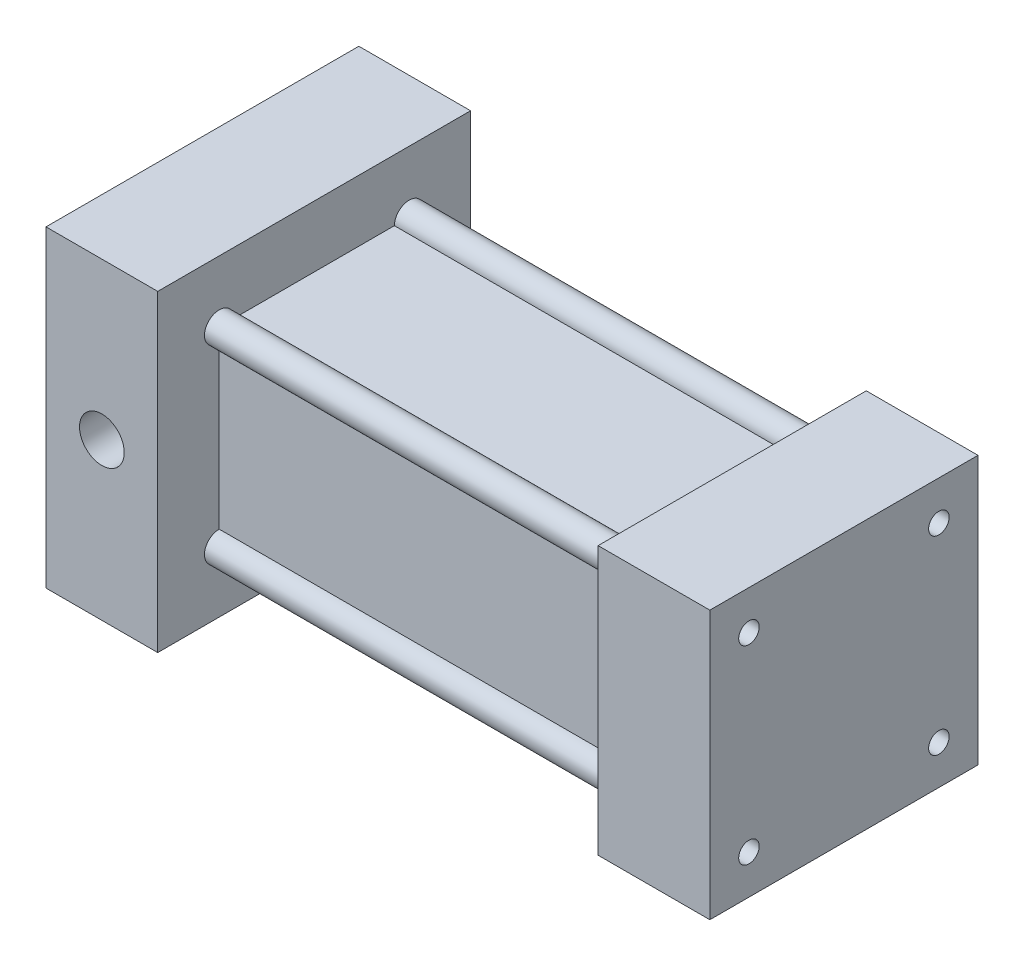
ISO-10303-21;
HEADER;
FILE_DESCRIPTION(('STEP AP214'),'2;1');
FILE_NAME('part.step','',(''),(''),'','','');
FILE_SCHEMA(('AUTOMOTIVE_DESIGN { 1 0 10303 214 1 1 1 1 }'));
ENDSEC;
DATA;
#1=APPLICATION_CONTEXT('core data for automotive mechanical design processes');
#2=APPLICATION_PROTOCOL_DEFINITION('international standard','automotive_design',2000,#1);
#3=PRODUCT_CONTEXT('',#1,'mechanical');
#4=PRODUCT('Part','Part','',(#3));
#5=PRODUCT_RELATED_PRODUCT_CATEGORY('part','',(#4));
#6=PRODUCT_DEFINITION_FORMATION('','',#4);
#7=PRODUCT_DEFINITION_CONTEXT('part definition',#1,'design');
#8=PRODUCT_DEFINITION('design','',#6,#7);
#9=PRODUCT_DEFINITION_SHAPE('','',#8);
#10=(LENGTH_UNIT() NAMED_UNIT(*) SI_UNIT(.MILLI.,.METRE.));
#11=(NAMED_UNIT(*) PLANE_ANGLE_UNIT() SI_UNIT($,.RADIAN.));
#12=(NAMED_UNIT(*) SI_UNIT($,.STERADIAN.) SOLID_ANGLE_UNIT());
#13=UNCERTAINTY_MEASURE_WITH_UNIT(LENGTH_MEASURE(1.E-05),#10,'distance_accuracy_value','');
#14=(GEOMETRIC_REPRESENTATION_CONTEXT(3) GLOBAL_UNCERTAINTY_ASSIGNED_CONTEXT((#13)) GLOBAL_UNIT_ASSIGNED_CONTEXT((#10,
#11,#12)) REPRESENTATION_CONTEXT('',''));
#15=CARTESIAN_POINT('',(0.,0.,0.));
#16=DIRECTION('',(0.,0.,1.));
#17=DIRECTION('',(1.,0.,0.));
#18=AXIS2_PLACEMENT_3D('',#15,#16,#17);
#19=CARTESIAN_POINT('',(67.33286,-13.49248,-13.49248));
#20=DIRECTION('',(0.,0.,1.));
#21=DIRECTION('',(0.,-1.,0.));
#22=AXIS2_PLACEMENT_3D('',#19,#20,#21);
#23=PLANE('',#22);
#24=DIRECTION('',(-1.,0.,0.));
#25=VECTOR('',#24,1.);
#26=CARTESIAN_POINT('',(73.2526448350306,-11.39952,-13.49248));
#27=LINE('',#26,#25);
#28=CARTESIAN_POINT('',(7.9375,-11.39952,-13.49248));
#29=VERTEX_POINT('',#28);
#30=CARTESIAN_POINT('',(67.3328600000218,-11.39952,-13.49248));
#31=VERTEX_POINT('',#30);
#32=EDGE_CURVE('E56',#29,#31,#27,.F.);
#33=ORIENTED_EDGE('',*,*,#32,.F.);
#34=DIRECTION('',(0.,1.,0.));
#35=VECTOR('',#34,1.);
#36=CARTESIAN_POINT('',(7.9375,-13.49248,-13.49248));
#37=LINE('',#36,#35);
#38=CARTESIAN_POINT('',(7.9375,11.39952,-13.49248));
#39=VERTEX_POINT('',#38);
#40=EDGE_CURVE('E187',#29,#39,#37,.T.);
#41=ORIENTED_EDGE('',*,*,#40,.T.);
#42=DIRECTION('',(-1.,0.,0.));
#43=VECTOR('',#42,1.);
#44=CARTESIAN_POINT('',(73.2526448350306,11.39952,-13.49248));
#45=LINE('',#44,#43);
#46=CARTESIAN_POINT('',(67.3328600000218,11.39952,-13.49248));
#47=VERTEX_POINT('',#46);
#48=EDGE_CURVE('E358',#47,#39,#45,.T.);
#49=ORIENTED_EDGE('',*,*,#48,.F.);
#50=DIRECTION('',(0.,1.,0.));
#51=VECTOR('',#50,1.);
#52=CARTESIAN_POINT('',(67.33286,-13.49248,-13.49248));
#53=LINE('',#52,#51);
#54=EDGE_CURVE('E170',#31,#47,#53,.T.);
#55=ORIENTED_EDGE('',*,*,#54,.F.);
#56=EDGE_LOOP('',(#33,#41,#49,#55));
#57=FACE_BOUND('',#56,.T.);
#58=ADVANCED_FACE('F41',(#57),#23,.F.);
#59=CARTESIAN_POINT('',(67.33286,-13.49248,-13.49248));
#60=DIRECTION('',(0.,-1.,0.));
#61=DIRECTION('',(1.,0.,0.));
#62=AXIS2_PLACEMENT_3D('',#59,#60,#61);
#63=PLANE('',#62);
#64=DIRECTION('',(0.,0.,1.));
#65=VECTOR('',#64,1.);
#66=CARTESIAN_POINT('',(7.9375,-13.49248,-13.49248));
#67=LINE('',#66,#65);
#68=CARTESIAN_POINT('',(7.9375,-13.49248,-11.39952));
#69=VERTEX_POINT('',#68);
#70=CARTESIAN_POINT('',(7.9375,-13.49248,11.39952));
#71=VERTEX_POINT('',#70);
#72=EDGE_CURVE('E164',#69,#71,#67,.T.);
#73=ORIENTED_EDGE('',*,*,#72,.F.);
#74=DIRECTION('',(-1.,0.,0.));
#75=VECTOR('',#74,1.);
#76=CARTESIAN_POINT('',(73.2526448350306,-13.49248,-11.39952));
#77=LINE('',#76,#75);
#78=CARTESIAN_POINT('',(67.3328600000218,-13.49248,-11.39952));
#79=VERTEX_POINT('',#78);
#80=EDGE_CURVE('E153',#69,#79,#77,.F.);
#81=ORIENTED_EDGE('',*,*,#80,.T.);
#82=DIRECTION('',(0.,0.,1.));
#83=VECTOR('',#82,1.);
#84=CARTESIAN_POINT('',(67.33286,-13.49248,-13.49248));
#85=LINE('',#84,#83);
#86=CARTESIAN_POINT('',(67.3328600000218,-13.49248,11.39952));
#87=VERTEX_POINT('',#86);
#88=EDGE_CURVE('E162',#79,#87,#85,.T.);
#89=ORIENTED_EDGE('',*,*,#88,.T.);
#90=DIRECTION('',(-1.,0.,0.));
#91=VECTOR('',#90,1.);
#92=CARTESIAN_POINT('',(73.2526448350306,-13.49248,11.39952));
#93=LINE('',#92,#91);
#94=EDGE_CURVE('E237',#87,#71,#93,.T.);
#95=ORIENTED_EDGE('',*,*,#94,.T.);
#96=EDGE_LOOP('',(#73,#81,#89,#95));
#97=FACE_BOUND('',#96,.T.);
#98=ADVANCED_FACE('F160',(#97),#63,.T.);
#99=CARTESIAN_POINT('',(67.33286,13.49248,13.49248));
#100=DIRECTION('',(0.,1.,0.));
#101=DIRECTION('',(-1.,0.,0.));
#102=AXIS2_PLACEMENT_3D('',#99,#100,#101);
#103=PLANE('',#102);
#104=DIRECTION('',(0.,0.,-1.));
#105=VECTOR('',#104,1.);
#106=CARTESIAN_POINT('',(67.33286,13.49248,13.49248));
#107=LINE('',#106,#105);
#108=CARTESIAN_POINT('',(67.3328600000218,13.49248,11.39952));
#109=VERTEX_POINT('',#108);
#110=CARTESIAN_POINT('',(67.3328600000218,13.49248,-11.39952));
#111=VERTEX_POINT('',#110);
#112=EDGE_CURVE('E173',#109,#111,#107,.T.);
#113=ORIENTED_EDGE('',*,*,#112,.T.);
#114=DIRECTION('',(-1.,0.,0.));
#115=VECTOR('',#114,1.);
#116=CARTESIAN_POINT('',(73.2526448350306,13.49248,-11.39952));
#117=LINE('',#116,#115);
#118=CARTESIAN_POINT('',(7.9375,13.49248,-11.39952));
#119=VERTEX_POINT('',#118);
#120=EDGE_CURVE('E63',#111,#119,#117,.T.);
#121=ORIENTED_EDGE('',*,*,#120,.T.);
#122=DIRECTION('',(0.,0.,-1.));
#123=VECTOR('',#122,1.);
#124=CARTESIAN_POINT('',(7.9375,13.49248,13.49248));
#125=LINE('',#124,#123);
#126=CARTESIAN_POINT('',(7.9375,13.49248,11.39952));
#127=VERTEX_POINT('',#126);
#128=EDGE_CURVE('E175',#127,#119,#125,.T.);
#129=ORIENTED_EDGE('',*,*,#128,.F.);
#130=DIRECTION('',(-1.,0.,0.));
#131=VECTOR('',#130,1.);
#132=CARTESIAN_POINT('',(73.2526448350306,13.49248,11.39952));
#133=LINE('',#132,#131);
#134=EDGE_CURVE('E239',#127,#109,#133,.F.);
#135=ORIENTED_EDGE('',*,*,#134,.T.);
#136=EDGE_LOOP('',(#113,#121,#129,#135));
#137=FACE_BOUND('',#136,.T.);
#138=ADVANCED_FACE('F312',(#137),#103,.T.);
#139=CARTESIAN_POINT('',(67.33286,13.49248,13.49248));
#140=DIRECTION('',(0.,0.,-1.));
#141=DIRECTION('',(0.,1.,0.));
#142=AXIS2_PLACEMENT_3D('',#139,#140,#141);
#143=PLANE('',#142);
#144=DIRECTION('',(-1.,0.,0.));
#145=VECTOR('',#144,1.);
#146=CARTESIAN_POINT('',(73.2526448350306,-11.39952,13.49248));
#147=LINE('',#146,#145);
#148=CARTESIAN_POINT('',(67.3328600000218,-11.39952,13.49248));
#149=VERTEX_POINT('',#148);
#150=CARTESIAN_POINT('',(7.9375,-11.39952,13.49248));
#151=VERTEX_POINT('',#150);
#152=EDGE_CURVE('E232',#149,#151,#147,.T.);
#153=ORIENTED_EDGE('',*,*,#152,.F.);
#154=DIRECTION('',(0.,-1.,0.));
#155=VECTOR('',#154,1.);
#156=CARTESIAN_POINT('',(67.33286,13.49248,13.49248));
#157=LINE('',#156,#155);
#158=CARTESIAN_POINT('',(67.3328600000218,11.39952,13.49248));
#159=VERTEX_POINT('',#158);
#160=EDGE_CURVE('E171',#159,#149,#157,.T.);
#161=ORIENTED_EDGE('',*,*,#160,.F.);
#162=DIRECTION('',(-1.,0.,0.));
#163=VECTOR('',#162,1.);
#164=CARTESIAN_POINT('',(73.2526448350306,11.39952,13.49248));
#165=LINE('',#164,#163);
#166=CARTESIAN_POINT('',(7.9375,11.39952,13.49248));
#167=VERTEX_POINT('',#166);
#168=EDGE_CURVE('E230',#167,#159,#165,.F.);
#169=ORIENTED_EDGE('',*,*,#168,.F.);
#170=DIRECTION('',(0.,-1.,0.));
#171=VECTOR('',#170,1.);
#172=CARTESIAN_POINT('',(7.9375,13.49248,13.49248));
#173=LINE('',#172,#171);
#174=EDGE_CURVE('E182',#167,#151,#173,.T.);
#175=ORIENTED_EDGE('',*,*,#174,.T.);
#176=EDGE_LOOP('',(#153,#161,#169,#175));
#177=FACE_BOUND('',#176,.T.);
#178=ADVANCED_FACE('F229',(#177),#143,.F.);
#179=CARTESIAN_POINT('',(7.93750000000001,22.225,22.225));
#180=DIRECTION('',(1.,0.,0.));
#181=DIRECTION('',(0.,1.,0.));
#182=AXIS2_PLACEMENT_3D('',#179,#180,#181);
#183=PLANE('',#182);
#184=DIRECTION('',(0.,-1.,0.));
#185=VECTOR('',#184,1.);
#186=CARTESIAN_POINT('',(7.93750000000001,22.225,-22.225));
#187=LINE('',#186,#185);
#188=CARTESIAN_POINT('',(7.93750000000001,22.225,-22.225));
#189=VERTEX_POINT('',#188);
#190=CARTESIAN_POINT('',(7.9375,-22.225,-22.225));
#191=VERTEX_POINT('',#190);
#192=EDGE_CURVE('E208',#189,#191,#187,.T.);
#193=ORIENTED_EDGE('',*,*,#192,.F.);
#194=DIRECTION('',(0.,0.,-1.));
#195=VECTOR('',#194,1.);
#196=CARTESIAN_POINT('',(7.93750000000001,22.225,22.225));
#197=LINE('',#196,#195);
#198=CARTESIAN_POINT('',(7.93750000000001,22.225,22.225));
#199=VERTEX_POINT('',#198);
#200=EDGE_CURVE('E218',#199,#189,#197,.T.);
#201=ORIENTED_EDGE('',*,*,#200,.F.);
#202=DIRECTION('',(0.,-1.,0.));
#203=VECTOR('',#202,1.);
#204=CARTESIAN_POINT('',(7.93750000000001,22.225,22.225));
#205=LINE('',#204,#203);
#206=CARTESIAN_POINT('',(7.9375,-22.225,22.225));
#207=VERTEX_POINT('',#206);
#208=EDGE_CURVE('E197',#199,#207,#205,.T.);
#209=ORIENTED_EDGE('',*,*,#208,.T.);
#210=DIRECTION('',(0.,0.,-1.));
#211=VECTOR('',#210,1.);
#212=CARTESIAN_POINT('',(7.9375,-22.225,22.225));
#213=LINE('',#212,#211);
#214=EDGE_CURVE('E216',#207,#191,#213,.T.);
#215=ORIENTED_EDGE('',*,*,#214,.T.);
#216=EDGE_LOOP('',(#193,#201,#209,#215));
#217=FACE_BOUND('',#216,.T.);
#218=ORIENTED_EDGE('',*,*,#40,.F.);
#219=CARTESIAN_POINT('',(7.9375,-13.49248,-13.49248));
#220=DIRECTION('',(1.,0.,0.));
#221=DIRECTION('',(0.,1.,0.));
#222=AXIS2_PLACEMENT_3D('',#219,#220,#221);
#223=CIRCLE('',#222,2.09296);
#224=EDGE_CURVE('E165',#69,#29,#223,.T.);
#225=ORIENTED_EDGE('',*,*,#224,.F.);
#226=ORIENTED_EDGE('',*,*,#72,.T.);
#227=CARTESIAN_POINT('',(7.9375,-13.49248,13.49248));
#228=DIRECTION('',(1.,0.,0.));
#229=DIRECTION('',(0.,1.,0.));
#230=AXIS2_PLACEMENT_3D('',#227,#228,#229);
#231=CIRCLE('',#230,2.09296);
#232=EDGE_CURVE('E241',#151,#71,#231,.T.);
#233=ORIENTED_EDGE('',*,*,#232,.F.);
#234=ORIENTED_EDGE('',*,*,#174,.F.);
#235=CARTESIAN_POINT('',(7.9375,13.49248,13.49248));
#236=DIRECTION('',(1.,0.,0.));
#237=DIRECTION('',(0.,1.,0.));
#238=AXIS2_PLACEMENT_3D('',#235,#236,#237);
#239=CIRCLE('',#238,2.09296);
#240=EDGE_CURVE('E236',#127,#167,#239,.T.);
#241=ORIENTED_EDGE('',*,*,#240,.F.);
#242=ORIENTED_EDGE('',*,*,#128,.T.);
#243=CARTESIAN_POINT('',(7.9375,13.49248,-13.49248));
#244=DIRECTION('',(1.,0.,0.));
#245=DIRECTION('',(0.,1.,0.));
#246=AXIS2_PLACEMENT_3D('',#243,#244,#245);
#247=CIRCLE('',#246,2.09296);
#248=EDGE_CURVE('E355',#39,#119,#247,.T.);
#249=ORIENTED_EDGE('',*,*,#248,.F.);
#250=EDGE_LOOP('',(#218,#225,#226,#233,#234,#241,#242,#249));
#251=FACE_BOUND('',#250,.T.);
#252=ADVANCED_FACE('F319',(#217,#251),#183,.T.);
#253=CARTESIAN_POINT('',(-7.9375,-22.225,22.225));
#254=DIRECTION('',(-1.,0.,0.));
#255=DIRECTION('',(0.,0.,1.));
#256=AXIS2_PLACEMENT_3D('',#253,#254,#255);
#257=PLANE('',#256);
#258=CARTESIAN_POINT('',(-7.9375,0.,0.));
#259=DIRECTION('',(-1.,0.,0.));
#260=DIRECTION('',(0.,0.,1.));
#261=AXIS2_PLACEMENT_3D('',#258,#259,#260);
#262=CIRCLE('',#261,4.7625);
#263=CARTESIAN_POINT('',(-7.9375,0.,4.7625));
#264=VERTEX_POINT('',#263);
#265=EDGE_CURVE('E720',#264,#264,#262,.T.);
#266=ORIENTED_EDGE('',*,*,#265,.F.);
#267=EDGE_LOOP('',(#266));
#268=FACE_BOUND('',#267,.T.);
#269=DIRECTION('',(0.,1.,0.));
#270=VECTOR('',#269,1.);
#271=CARTESIAN_POINT('',(-7.9375,-22.225,-22.225));
#272=LINE('',#271,#270);
#273=CARTESIAN_POINT('',(-7.9375,-22.225,-22.225));
#274=VERTEX_POINT('',#273);
#275=CARTESIAN_POINT('',(-7.9375,22.225,-22.225));
#276=VERTEX_POINT('',#275);
#277=EDGE_CURVE('E181',#274,#276,#272,.T.);
#278=ORIENTED_EDGE('',*,*,#277,.F.);
#279=DIRECTION('',(0.,0.,-1.));
#280=VECTOR('',#279,1.);
#281=CARTESIAN_POINT('',(-7.9375,-22.225,22.225));
#282=LINE('',#281,#280);
#283=CARTESIAN_POINT('',(-7.9375,-22.225,22.225));
#284=VERTEX_POINT('',#283);
#285=EDGE_CURVE('E213',#284,#274,#282,.T.);
#286=ORIENTED_EDGE('',*,*,#285,.F.);
#287=DIRECTION('',(0.,1.,0.));
#288=VECTOR('',#287,1.);
#289=CARTESIAN_POINT('',(-7.9375,-22.225,22.225));
#290=LINE('',#289,#288);
#291=CARTESIAN_POINT('',(-7.9375,22.225,22.225));
#292=VERTEX_POINT('',#291);
#293=EDGE_CURVE('E191',#284,#292,#290,.T.);
#294=ORIENTED_EDGE('',*,*,#293,.T.);
#295=DIRECTION('',(0.,0.,-1.));
#296=VECTOR('',#295,1.);
#297=CARTESIAN_POINT('',(-7.9375,22.225,22.225));
#298=LINE('',#297,#296);
#299=EDGE_CURVE('E202',#292,#276,#298,.T.);
#300=ORIENTED_EDGE('',*,*,#299,.T.);
#301=EDGE_LOOP('',(#278,#286,#294,#300));
#302=FACE_BOUND('',#301,.T.);
#303=ADVANCED_FACE('F43',(#268,#302),#257,.T.);
#304=CARTESIAN_POINT('',(-7.9375,-22.225,22.225));
#305=DIRECTION('',(0.,1.,0.));
#306=DIRECTION('',(0.,0.,1.));
#307=AXIS2_PLACEMENT_3D('',#304,#305,#306);
#308=PLANE('',#307);
#309=DIRECTION('',(1.,0.,0.));
#310=VECTOR('',#309,1.);
#311=CARTESIAN_POINT('',(-7.9375,-22.225,-22.225));
#312=LINE('',#311,#310);
#313=EDGE_CURVE('E195',#274,#191,#312,.T.);
#314=ORIENTED_EDGE('',*,*,#313,.T.);
#315=ORIENTED_EDGE('',*,*,#214,.F.);
#316=DIRECTION('',(1.,0.,0.));
#317=VECTOR('',#316,1.);
#318=CARTESIAN_POINT('',(-7.9375,-22.225,22.225));
#319=LINE('',#318,#317);
#320=EDGE_CURVE('E200',#284,#207,#319,.T.);
#321=ORIENTED_EDGE('',*,*,#320,.F.);
#322=ORIENTED_EDGE('',*,*,#285,.T.);
#323=EDGE_LOOP('',(#314,#315,#321,#322));
#324=FACE_BOUND('',#323,.T.);
#325=ADVANCED_FACE('F329',(#324),#308,.F.);
#326=CARTESIAN_POINT('',(7.93750000000001,22.225,22.225));
#327=DIRECTION('',(0.,-1.,0.));
#328=DIRECTION('',(0.,0.,-1.));
#329=AXIS2_PLACEMENT_3D('',#326,#327,#328);
#330=PLANE('',#329);
#331=DIRECTION('',(-1.,0.,0.));
#332=VECTOR('',#331,1.);
#333=CARTESIAN_POINT('',(7.93750000000001,22.225,-22.225));
#334=LINE('',#333,#332);
#335=EDGE_CURVE('E205',#189,#276,#334,.T.);
#336=ORIENTED_EDGE('',*,*,#335,.T.);
#337=ORIENTED_EDGE('',*,*,#299,.F.);
#338=DIRECTION('',(-1.,0.,0.));
#339=VECTOR('',#338,1.);
#340=CARTESIAN_POINT('',(7.93750000000001,22.225,22.225));
#341=LINE('',#340,#339);
#342=EDGE_CURVE('E194',#199,#292,#341,.T.);
#343=ORIENTED_EDGE('',*,*,#342,.F.);
#344=ORIENTED_EDGE('',*,*,#200,.T.);
#345=EDGE_LOOP('',(#336,#337,#343,#344));
#346=FACE_BOUND('',#345,.T.);
#347=ADVANCED_FACE('F324',(#346),#330,.F.);
#348=CARTESIAN_POINT('',(-7.9375,22.225,22.225));
#349=DIRECTION('',(0.,0.,1.));
#350=DIRECTION('',(1.,0.,0.));
#351=AXIS2_PLACEMENT_3D('',#348,#349,#350);
#352=PLANE('',#351);
#353=CARTESIAN_POINT('',(0.,0.,22.225));
#354=DIRECTION('',(0.,0.,1.));
#355=DIRECTION('',(1.,0.,0.));
#356=AXIS2_PLACEMENT_3D('',#353,#354,#355);
#357=CIRCLE('',#356,3.175);
#358=CARTESIAN_POINT('',(3.175,0.,22.225));
#359=VERTEX_POINT('',#358);
#360=EDGE_CURVE('E710',#359,#359,#357,.T.);
#361=ORIENTED_EDGE('',*,*,#360,.F.);
#362=EDGE_LOOP('',(#361));
#363=FACE_BOUND('',#362,.T.);
#364=ORIENTED_EDGE('',*,*,#293,.F.);
#365=ORIENTED_EDGE('',*,*,#320,.T.);
#366=ORIENTED_EDGE('',*,*,#208,.F.);
#367=ORIENTED_EDGE('',*,*,#342,.T.);
#368=EDGE_LOOP('',(#364,#365,#366,#367));
#369=FACE_BOUND('',#368,.T.);
#370=ADVANCED_FACE('F320',(#363,#369),#352,.T.);
#371=CARTESIAN_POINT('',(-7.9375,22.225,-22.225));
#372=DIRECTION('',(0.,0.,1.));
#373=DIRECTION('',(1.,0.,0.));
#374=AXIS2_PLACEMENT_3D('',#371,#372,#373);
#375=PLANE('',#374);
#376=CARTESIAN_POINT('',(0.,0.,-22.225));
#377=DIRECTION('',(0.,0.,1.));
#378=DIRECTION('',(1.,0.,0.));
#379=AXIS2_PLACEMENT_3D('',#376,#377,#378);
#380=CIRCLE('',#379,3.175);
#381=CARTESIAN_POINT('',(3.175,0.,-22.225));
#382=VERTEX_POINT('',#381);
#383=EDGE_CURVE('E711',#382,#382,#380,.T.);
#384=ORIENTED_EDGE('',*,*,#383,.T.);
#385=EDGE_LOOP('',(#384));
#386=FACE_BOUND('',#385,.T.);
#387=ORIENTED_EDGE('',*,*,#277,.T.);
#388=ORIENTED_EDGE('',*,*,#335,.F.);
#389=ORIENTED_EDGE('',*,*,#192,.T.);
#390=ORIENTED_EDGE('',*,*,#313,.F.);
#391=EDGE_LOOP('',(#387,#388,#389,#390));
#392=FACE_BOUND('',#391,.T.);
#393=ADVANCED_FACE('F323',(#386,#392),#375,.F.);
#394=CARTESIAN_POINT('',(67.3328600000218,-19.05,19.05));
#395=DIRECTION('',(-1.,0.,0.));
#396=DIRECTION('',(0.,0.,1.));
#397=AXIS2_PLACEMENT_3D('',#394,#395,#396);
#398=PLANE('',#397);
#399=DIRECTION('',(0.,-1.,0.));
#400=VECTOR('',#399,1.);
#401=CARTESIAN_POINT('',(67.3328600000218,19.05,19.05));
#402=LINE('',#401,#400);
#403=CARTESIAN_POINT('',(67.3328600000218,19.05,19.05));
#404=VERTEX_POINT('',#403);
#405=CARTESIAN_POINT('',(67.3328600000218,-19.05,19.05));
#406=VERTEX_POINT('',#405);
#407=EDGE_CURVE('E247',#404,#406,#402,.T.);
#408=ORIENTED_EDGE('',*,*,#407,.F.);
#409=DIRECTION('',(0.,0.,-1.));
#410=VECTOR('',#409,1.);
#411=CARTESIAN_POINT('',(67.3328600000218,19.05,19.05));
#412=LINE('',#411,#410);
#413=CARTESIAN_POINT('',(67.3328600000218,19.05,-19.05));
#414=VERTEX_POINT('',#413);
#415=EDGE_CURVE('E251',#404,#414,#412,.T.);
#416=ORIENTED_EDGE('',*,*,#415,.T.);
#417=DIRECTION('',(0.,1.,0.));
#418=VECTOR('',#417,1.);
#419=CARTESIAN_POINT('',(67.3328600000218,-19.05,-19.05));
#420=LINE('',#419,#418);
#421=CARTESIAN_POINT('',(67.3328600000218,-19.05,-19.05));
#422=VERTEX_POINT('',#421);
#423=EDGE_CURVE('E265',#422,#414,#420,.T.);
#424=ORIENTED_EDGE('',*,*,#423,.F.);
#425=DIRECTION('',(0.,0.,1.));
#426=VECTOR('',#425,1.);
#427=CARTESIAN_POINT('',(67.3328600000218,-19.05,-19.05));
#428=LINE('',#427,#426);
#429=EDGE_CURVE('E262',#422,#406,#428,.T.);
#430=ORIENTED_EDGE('',*,*,#429,.T.);
#431=EDGE_LOOP('',(#408,#416,#424,#430));
#432=FACE_BOUND('',#431,.T.);
#433=ORIENTED_EDGE('',*,*,#88,.F.);
#434=CARTESIAN_POINT('',(67.3328600000218,-13.49248,-13.49248));
#435=DIRECTION('',(-1.,0.,0.));
#436=DIRECTION('',(0.,0.,1.));
#437=AXIS2_PLACEMENT_3D('',#434,#435,#436);
#438=CIRCLE('',#437,2.09296);
#439=EDGE_CURVE('E11',#79,#31,#438,.F.);
#440=ORIENTED_EDGE('',*,*,#439,.T.);
#441=ORIENTED_EDGE('',*,*,#54,.T.);
#442=CARTESIAN_POINT('',(67.3328600000218,13.49248,-13.49248));
#443=DIRECTION('',(-1.,0.,0.));
#444=DIRECTION('',(0.,0.,1.));
#445=AXIS2_PLACEMENT_3D('',#442,#443,#444);
#446=CIRCLE('',#445,2.09296);
#447=EDGE_CURVE('E360',#111,#47,#446,.T.);
#448=ORIENTED_EDGE('',*,*,#447,.F.);
#449=ORIENTED_EDGE('',*,*,#112,.F.);
#450=CARTESIAN_POINT('',(67.3328600000218,13.49248,13.49248));
#451=DIRECTION('',(-1.,0.,0.));
#452=DIRECTION('',(0.,0.,1.));
#453=AXIS2_PLACEMENT_3D('',#450,#451,#452);
#454=CIRCLE('',#453,2.09296);
#455=EDGE_CURVE('E215',#109,#159,#454,.F.);
#456=ORIENTED_EDGE('',*,*,#455,.T.);
#457=ORIENTED_EDGE('',*,*,#160,.T.);
#458=CARTESIAN_POINT('',(67.3328600000218,-13.49248,13.49248));
#459=DIRECTION('',(-1.,0.,0.));
#460=DIRECTION('',(0.,0.,1.));
#461=AXIS2_PLACEMENT_3D('',#458,#459,#460);
#462=CIRCLE('',#461,2.09296);
#463=EDGE_CURVE('E49',#149,#87,#462,.F.);
#464=ORIENTED_EDGE('',*,*,#463,.T.);
#465=EDGE_LOOP('',(#433,#440,#441,#448,#449,#456,#457,#464));
#466=FACE_BOUND('',#465,.T.);
#467=ADVANCED_FACE('F168',(#432,#466),#398,.T.);
#468=CARTESIAN_POINT('',(83.2078600000218,19.05,19.05));
#469=DIRECTION('',(0.,0.,-1.));
#470=DIRECTION('',(0.,1.,0.));
#471=AXIS2_PLACEMENT_3D('',#468,#469,#470);
#472=PLANE('',#471);
#473=ORIENTED_EDGE('',*,*,#407,.T.);
#474=DIRECTION('',(-1.,0.,0.));
#475=VECTOR('',#474,1.);
#476=CARTESIAN_POINT('',(83.2078600000218,-19.05,19.05));
#477=LINE('',#476,#475);
#478=CARTESIAN_POINT('',(83.2078600000218,-19.05,19.05));
#479=VERTEX_POINT('',#478);
#480=EDGE_CURVE('E185',#479,#406,#477,.T.);
#481=ORIENTED_EDGE('',*,*,#480,.F.);
#482=DIRECTION('',(0.,-1.,0.));
#483=VECTOR('',#482,1.);
#484=CARTESIAN_POINT('',(83.2078600000218,19.05,19.05));
#485=LINE('',#484,#483);
#486=CARTESIAN_POINT('',(83.2078600000218,19.05,19.05));
#487=VERTEX_POINT('',#486);
#488=EDGE_CURVE('E248',#487,#479,#485,.T.);
#489=ORIENTED_EDGE('',*,*,#488,.F.);
#490=DIRECTION('',(-1.,0.,0.));
#491=VECTOR('',#490,1.);
#492=CARTESIAN_POINT('',(83.2078600000218,19.05,19.05));
#493=LINE('',#492,#491);
#494=EDGE_CURVE('E259',#487,#404,#493,.T.);
#495=ORIENTED_EDGE('',*,*,#494,.T.);
#496=EDGE_LOOP('',(#473,#481,#489,#495));
#497=FACE_BOUND('',#496,.T.);
#498=ADVANCED_FACE('F282',(#497),#472,.F.);
#499=CARTESIAN_POINT('',(83.2078600000218,-19.05,-19.05));
#500=DIRECTION('',(0.,-1.,0.));
#501=DIRECTION('',(0.,0.,-1.));
#502=AXIS2_PLACEMENT_3D('',#499,#500,#501);
#503=PLANE('',#502);
#504=ORIENTED_EDGE('',*,*,#429,.F.);
#505=DIRECTION('',(-1.,0.,0.));
#506=VECTOR('',#505,1.);
#507=CARTESIAN_POINT('',(83.2078600000218,-19.05,-19.05));
#508=LINE('',#507,#506);
#509=CARTESIAN_POINT('',(83.2078600000218,-19.05,-19.05));
#510=VERTEX_POINT('',#509);
#511=EDGE_CURVE('E273',#510,#422,#508,.T.);
#512=ORIENTED_EDGE('',*,*,#511,.F.);
#513=DIRECTION('',(0.,0.,1.));
#514=VECTOR('',#513,1.);
#515=CARTESIAN_POINT('',(83.2078600000218,-19.05,-19.05));
#516=LINE('',#515,#514);
#517=EDGE_CURVE('E250',#510,#479,#516,.T.);
#518=ORIENTED_EDGE('',*,*,#517,.T.);
#519=ORIENTED_EDGE('',*,*,#480,.T.);
#520=EDGE_LOOP('',(#504,#512,#518,#519));
#521=FACE_BOUND('',#520,.T.);
#522=ADVANCED_FACE('F277',(#521),#503,.T.);
#523=CARTESIAN_POINT('',(83.2078600000218,-19.05,-19.05));
#524=DIRECTION('',(0.,0.,1.));
#525=DIRECTION('',(1.,0.,0.));
#526=AXIS2_PLACEMENT_3D('',#523,#524,#525);
#527=PLANE('',#526);
#528=ORIENTED_EDGE('',*,*,#423,.T.);
#529=DIRECTION('',(-1.,0.,0.));
#530=VECTOR('',#529,1.);
#531=CARTESIAN_POINT('',(83.2078600000218,19.05,-19.05));
#532=LINE('',#531,#530);
#533=CARTESIAN_POINT('',(83.2078600000218,19.05,-19.05));
#534=VERTEX_POINT('',#533);
#535=EDGE_CURVE('E271',#534,#414,#532,.T.);
#536=ORIENTED_EDGE('',*,*,#535,.F.);
#537=DIRECTION('',(0.,1.,0.));
#538=VECTOR('',#537,1.);
#539=CARTESIAN_POINT('',(83.2078600000218,-19.05,-19.05));
#540=LINE('',#539,#538);
#541=EDGE_CURVE('E254',#510,#534,#540,.T.);
#542=ORIENTED_EDGE('',*,*,#541,.F.);
#543=ORIENTED_EDGE('',*,*,#511,.T.);
#544=EDGE_LOOP('',(#528,#536,#542,#543));
#545=FACE_BOUND('',#544,.T.);
#546=ADVANCED_FACE('F288',(#545),#527,.F.);
#547=CARTESIAN_POINT('',(83.2078600000218,19.05,19.05));
#548=DIRECTION('',(0.,1.,0.));
#549=DIRECTION('',(0.,0.,1.));
#550=AXIS2_PLACEMENT_3D('',#547,#548,#549);
#551=PLANE('',#550);
#552=ORIENTED_EDGE('',*,*,#415,.F.);
#553=ORIENTED_EDGE('',*,*,#494,.F.);
#554=DIRECTION('',(0.,0.,-1.));
#555=VECTOR('',#554,1.);
#556=CARTESIAN_POINT('',(83.2078600000218,19.05,19.05));
#557=LINE('',#556,#555);
#558=EDGE_CURVE('E256',#487,#534,#557,.T.);
#559=ORIENTED_EDGE('',*,*,#558,.T.);
#560=ORIENTED_EDGE('',*,*,#535,.T.);
#561=EDGE_LOOP('',(#552,#553,#559,#560));
#562=FACE_BOUND('',#561,.T.);
#563=ADVANCED_FACE('F294',(#562),#551,.T.);
#564=CARTESIAN_POINT('',(83.2078600000218,-19.05,19.05));
#565=DIRECTION('',(-1.,0.,0.));
#566=DIRECTION('',(0.,0.,1.));
#567=AXIS2_PLACEMENT_3D('',#564,#565,#566);
#568=PLANE('',#567);
#569=CARTESIAN_POINT('',(83.2078600000218,-13.49248,13.49248));
#570=DIRECTION('',(1.,0.,0.));
#571=DIRECTION('',(0.,0.,-1.));
#572=AXIS2_PLACEMENT_3D('',#569,#570,#571);
#573=CIRCLE('',#572,1.45796);
#574=CARTESIAN_POINT('',(83.2078600000218,-13.49248,12.03452));
#575=VERTEX_POINT('',#574);
#576=EDGE_CURVE('E728',#575,#575,#573,.T.);
#577=ORIENTED_EDGE('',*,*,#576,.F.);
#578=EDGE_LOOP('',(#577));
#579=FACE_BOUND('',#578,.T.);
#580=CARTESIAN_POINT('',(83.2078600000218,13.49248,-13.49248));
#581=DIRECTION('',(1.,0.,0.));
#582=DIRECTION('',(0.,0.,-1.));
#583=AXIS2_PLACEMENT_3D('',#580,#581,#582);
#584=CIRCLE('',#583,1.45796);
#585=CARTESIAN_POINT('',(83.2078600000218,13.49248,-14.95044));
#586=VERTEX_POINT('',#585);
#587=EDGE_CURVE('E736',#586,#586,#584,.T.);
#588=ORIENTED_EDGE('',*,*,#587,.F.);
#589=EDGE_LOOP('',(#588));
#590=FACE_BOUND('',#589,.T.);
#591=CARTESIAN_POINT('',(83.2078600000218,-13.49248,-13.49248));
#592=DIRECTION('',(1.,0.,0.));
#593=DIRECTION('',(0.,0.,-1.));
#594=AXIS2_PLACEMENT_3D('',#591,#592,#593);
#595=CIRCLE('',#594,1.45796);
#596=CARTESIAN_POINT('',(83.2078600000218,-13.49248,-14.95044));
#597=VERTEX_POINT('',#596);
#598=EDGE_CURVE('E727',#597,#597,#595,.T.);
#599=ORIENTED_EDGE('',*,*,#598,.F.);
#600=EDGE_LOOP('',(#599));
#601=FACE_BOUND('',#600,.T.);
#602=CARTESIAN_POINT('',(83.2078600000218,13.49248,13.49248));
#603=DIRECTION('',(1.,0.,0.));
#604=DIRECTION('',(0.,0.,-1.));
#605=AXIS2_PLACEMENT_3D('',#602,#603,#604);
#606=CIRCLE('',#605,1.45796);
#607=CARTESIAN_POINT('',(83.2078600000218,13.49248,12.03452));
#608=VERTEX_POINT('',#607);
#609=EDGE_CURVE('E735',#608,#608,#606,.T.);
#610=ORIENTED_EDGE('',*,*,#609,.F.);
#611=EDGE_LOOP('',(#610));
#612=FACE_BOUND('',#611,.T.);
#613=ORIENTED_EDGE('',*,*,#488,.T.);
#614=ORIENTED_EDGE('',*,*,#517,.F.);
#615=ORIENTED_EDGE('',*,*,#541,.T.);
#616=ORIENTED_EDGE('',*,*,#558,.F.);
#617=EDGE_LOOP('',(#613,#614,#615,#616));
#618=FACE_BOUND('',#617,.T.);
#619=ADVANCED_FACE('F292',(#579,#590,#601,#612,#618),#568,.F.);
#620=CARTESIAN_POINT('',(73.2526448350306,13.49248,13.49248));
#621=DIRECTION('',(-1.,0.,0.));
#622=DIRECTION('',(0.,-1.,0.));
#623=AXIS2_PLACEMENT_3D('',#620,#621,#622);
#624=CYLINDRICAL_SURFACE('',#623,2.09296);
#625=ORIENTED_EDGE('',*,*,#240,.T.);
#626=ORIENTED_EDGE('',*,*,#168,.T.);
#627=ORIENTED_EDGE('',*,*,#455,.F.);
#628=ORIENTED_EDGE('',*,*,#134,.F.);
#629=EDGE_LOOP('',(#625,#626,#627,#628));
#630=FACE_BOUND('',#629,.T.);
#631=ADVANCED_FACE('F301',(#630),#624,.T.);
#632=CARTESIAN_POINT('',(73.2526448350306,-13.49248,13.49248));
#633=DIRECTION('',(-1.,0.,0.));
#634=DIRECTION('',(0.,-1.,0.));
#635=AXIS2_PLACEMENT_3D('',#632,#633,#634);
#636=CYLINDRICAL_SURFACE('',#635,2.09296);
#637=ORIENTED_EDGE('',*,*,#463,.F.);
#638=ORIENTED_EDGE('',*,*,#152,.T.);
#639=ORIENTED_EDGE('',*,*,#232,.T.);
#640=ORIENTED_EDGE('',*,*,#94,.F.);
#641=EDGE_LOOP('',(#637,#638,#639,#640));
#642=FACE_BOUND('',#641,.T.);
#643=ADVANCED_FACE('F365',(#642),#636,.T.);
#644=CARTESIAN_POINT('',(73.2526448350306,13.49248,-13.49248));
#645=DIRECTION('',(-1.,0.,0.));
#646=DIRECTION('',(0.,-1.,0.));
#647=AXIS2_PLACEMENT_3D('',#644,#645,#646);
#648=CYLINDRICAL_SURFACE('',#647,2.09296);
#649=ORIENTED_EDGE('',*,*,#120,.F.);
#650=ORIENTED_EDGE('',*,*,#447,.T.);
#651=ORIENTED_EDGE('',*,*,#48,.T.);
#652=ORIENTED_EDGE('',*,*,#248,.T.);
#653=EDGE_LOOP('',(#649,#650,#651,#652));
#654=FACE_BOUND('',#653,.T.);
#655=ADVANCED_FACE('F359',(#654),#648,.T.);
#656=CARTESIAN_POINT('',(73.2526448350306,-13.49248,-13.49248));
#657=DIRECTION('',(-1.,0.,0.));
#658=DIRECTION('',(0.,-1.,0.));
#659=AXIS2_PLACEMENT_3D('',#656,#657,#658);
#660=CYLINDRICAL_SURFACE('',#659,2.09296);
#661=ORIENTED_EDGE('',*,*,#224,.T.);
#662=ORIENTED_EDGE('',*,*,#32,.T.);
#663=ORIENTED_EDGE('',*,*,#439,.F.);
#664=ORIENTED_EDGE('',*,*,#80,.F.);
#665=EDGE_LOOP('',(#661,#662,#663,#664));
#666=FACE_BOUND('',#665,.T.);
#667=ADVANCED_FACE('F152',(#666),#660,.T.);
#668=CARTESIAN_POINT('',(3.81376638920504,13.49248,13.49248));
#669=DIRECTION('',(1.,0.,0.));
#670=DIRECTION('',(0.,0.,-1.));
#671=AXIS2_PLACEMENT_3D('',#668,#669,#670);
#672=CYLINDRICAL_SURFACE('',#671,1.45796);
#673=CARTESIAN_POINT('',(7.9375,13.49248,13.49248));
#674=DIRECTION('',(1.,0.,0.));
#675=DIRECTION('',(0.,1.,0.));
#676=AXIS2_PLACEMENT_3D('',#673,#674,#675);
#677=CIRCLE('',#676,1.45796);
#678=CARTESIAN_POINT('',(7.9375,14.95044,13.49248));
#679=VERTEX_POINT('',#678);
#680=EDGE_CURVE('E748',#679,#679,#677,.F.);
#681=ORIENTED_EDGE('',*,*,#680,.T.);
#682=EDGE_LOOP('',(#681));
#683=FACE_BOUND('',#682,.T.);
#684=ORIENTED_EDGE('',*,*,#609,.T.);
#685=EDGE_LOOP('',(#684));
#686=FACE_BOUND('',#685,.T.);
#687=ADVANCED_FACE('F467',(#683,#686),#672,.F.);
#688=CARTESIAN_POINT('',(7.93750000000001,22.225,22.225));
#689=DIRECTION('',(1.,0.,0.));
#690=DIRECTION('',(0.,1.,0.));
#691=AXIS2_PLACEMENT_3D('',#688,#689,#690);
#692=PLANE('',#691);
#693=ORIENTED_EDGE('',*,*,#680,.F.);
#694=EDGE_LOOP('',(#693));
#695=FACE_BOUND('',#694,.T.);
#696=ADVANCED_FACE('F483',(#695),#692,.T.);
#697=CARTESIAN_POINT('',(3.81376638920504,-13.49248,-13.49248));
#698=DIRECTION('',(1.,0.,0.));
#699=DIRECTION('',(0.,0.,-1.));
#700=AXIS2_PLACEMENT_3D('',#697,#698,#699);
#701=CYLINDRICAL_SURFACE('',#700,1.45796);
#702=CARTESIAN_POINT('',(7.9375,-13.49248,-13.49248));
#703=DIRECTION('',(1.,0.,0.));
#704=DIRECTION('',(0.,1.,0.));
#705=AXIS2_PLACEMENT_3D('',#702,#703,#704);
#706=CIRCLE('',#705,1.45796);
#707=CARTESIAN_POINT('',(7.9375,-12.03452,-13.49248));
#708=VERTEX_POINT('',#707);
#709=EDGE_CURVE('E739',#708,#708,#706,.F.);
#710=ORIENTED_EDGE('',*,*,#709,.T.);
#711=EDGE_LOOP('',(#710));
#712=FACE_BOUND('',#711,.T.);
#713=ORIENTED_EDGE('',*,*,#598,.T.);
#714=EDGE_LOOP('',(#713));
#715=FACE_BOUND('',#714,.T.);
#716=ADVANCED_FACE('F494',(#712,#715),#701,.F.);
#717=CARTESIAN_POINT('',(7.93750000000001,22.225,22.225));
#718=DIRECTION('',(1.,0.,0.));
#719=DIRECTION('',(0.,1.,0.));
#720=AXIS2_PLACEMENT_3D('',#717,#718,#719);
#721=PLANE('',#720);
#722=ORIENTED_EDGE('',*,*,#709,.F.);
#723=EDGE_LOOP('',(#722));
#724=FACE_BOUND('',#723,.T.);
#725=ADVANCED_FACE('F505',(#724),#721,.T.);
#726=CARTESIAN_POINT('',(3.81376638920504,13.49248,-13.49248));
#727=DIRECTION('',(1.,0.,0.));
#728=DIRECTION('',(0.,0.,-1.));
#729=AXIS2_PLACEMENT_3D('',#726,#727,#728);
#730=CYLINDRICAL_SURFACE('',#729,1.45796);
#731=CARTESIAN_POINT('',(7.9375,13.49248,-13.49248));
#732=DIRECTION('',(1.,0.,0.));
#733=DIRECTION('',(0.,1.,0.));
#734=AXIS2_PLACEMENT_3D('',#731,#732,#733);
#735=CIRCLE('',#734,1.45796);
#736=CARTESIAN_POINT('',(7.9375,14.95044,-13.49248));
#737=VERTEX_POINT('',#736);
#738=EDGE_CURVE('E732',#737,#737,#735,.F.);
#739=ORIENTED_EDGE('',*,*,#738,.T.);
#740=EDGE_LOOP('',(#739));
#741=FACE_BOUND('',#740,.T.);
#742=ORIENTED_EDGE('',*,*,#587,.T.);
#743=EDGE_LOOP('',(#742));
#744=FACE_BOUND('',#743,.T.);
#745=ADVANCED_FACE('F516',(#741,#744),#730,.F.);
#746=CARTESIAN_POINT('',(7.93750000000001,22.225,22.225));
#747=DIRECTION('',(1.,0.,0.));
#748=DIRECTION('',(0.,1.,0.));
#749=AXIS2_PLACEMENT_3D('',#746,#747,#748);
#750=PLANE('',#749);
#751=ORIENTED_EDGE('',*,*,#738,.F.);
#752=EDGE_LOOP('',(#751));
#753=FACE_BOUND('',#752,.T.);
#754=ADVANCED_FACE('F527',(#753),#750,.T.);
#755=CARTESIAN_POINT('',(3.81376638920504,-13.49248,13.49248));
#756=DIRECTION('',(1.,0.,0.));
#757=DIRECTION('',(0.,0.,-1.));
#758=AXIS2_PLACEMENT_3D('',#755,#756,#757);
#759=CYLINDRICAL_SURFACE('',#758,1.45796);
#760=CARTESIAN_POINT('',(7.9375,-13.49248,13.49248));
#761=DIRECTION('',(1.,0.,0.));
#762=DIRECTION('',(0.,1.,0.));
#763=AXIS2_PLACEMENT_3D('',#760,#761,#762);
#764=CIRCLE('',#763,1.45796);
#765=CARTESIAN_POINT('',(7.9375,-12.03452,13.49248));
#766=VERTEX_POINT('',#765);
#767=EDGE_CURVE('E731',#766,#766,#764,.F.);
#768=ORIENTED_EDGE('',*,*,#767,.T.);
#769=EDGE_LOOP('',(#768));
#770=FACE_BOUND('',#769,.T.);
#771=ORIENTED_EDGE('',*,*,#576,.T.);
#772=EDGE_LOOP('',(#771));
#773=FACE_BOUND('',#772,.T.);
#774=ADVANCED_FACE('F538',(#770,#773),#759,.F.);
#775=CARTESIAN_POINT('',(7.93750000000001,22.225,22.225));
#776=DIRECTION('',(1.,0.,0.));
#777=DIRECTION('',(0.,1.,0.));
#778=AXIS2_PLACEMENT_3D('',#775,#776,#777);
#779=PLANE('',#778);
#780=ORIENTED_EDGE('',*,*,#767,.F.);
#781=EDGE_LOOP('',(#780));
#782=FACE_BOUND('',#781,.T.);
#783=ADVANCED_FACE('F549',(#782),#779,.T.);
#784=CARTESIAN_POINT('',(80.8032441816255,0.,0.));
#785=DIRECTION('',(-1.,0.,0.));
#786=DIRECTION('',(0.,0.,1.));
#787=AXIS2_PLACEMENT_3D('',#784,#785,#786);
#788=CYLINDRICAL_SURFACE('',#787,4.7625);
#789=CARTESIAN_POINT('',(67.3328600000218,0.,0.));
#790=DIRECTION('',(-1.,0.,0.));
#791=DIRECTION('',(0.,0.,1.));
#792=AXIS2_PLACEMENT_3D('',#789,#790,#791);
#793=CIRCLE('',#792,4.7625);
#794=CARTESIAN_POINT('',(67.3328600000218,0.,4.7625));
#795=VERTEX_POINT('',#794);
#796=EDGE_CURVE('E724',#795,#795,#793,.F.);
#797=ORIENTED_EDGE('',*,*,#796,.T.);
#798=EDGE_LOOP('',(#797));
#799=FACE_BOUND('',#798,.T.);
#800=ORIENTED_EDGE('',*,*,#265,.T.);
#801=EDGE_LOOP('',(#800));
#802=FACE_BOUND('',#801,.T.);
#803=ADVANCED_FACE('F560',(#799,#802),#788,.F.);
#804=CARTESIAN_POINT('',(67.3328600000218,-19.05,19.05));
#805=DIRECTION('',(-1.,0.,0.));
#806=DIRECTION('',(0.,0.,1.));
#807=AXIS2_PLACEMENT_3D('',#804,#805,#806);
#808=PLANE('',#807);
#809=ORIENTED_EDGE('',*,*,#796,.F.);
#810=EDGE_LOOP('',(#809));
#811=FACE_BOUND('',#810,.T.);
#812=ADVANCED_FACE('F581',(#811),#808,.T.);
#813=CARTESIAN_POINT('',(0.,0.,15.875));
#814=DIRECTION('',(0.,0.,1.));
#815=DIRECTION('',(1.,0.,0.));
#816=AXIS2_PLACEMENT_3D('',#813,#814,#815);
#817=CYLINDRICAL_SURFACE('',#816,3.175);
#818=CARTESIAN_POINT('',(0.,0.,15.875));
#819=DIRECTION('',(0.,0.,1.));
#820=DIRECTION('',(1.,0.,0.));
#821=AXIS2_PLACEMENT_3D('',#818,#819,#820);
#822=CIRCLE('',#821,3.175);
#823=CARTESIAN_POINT('',(3.175,0.,15.875));
#824=VERTEX_POINT('',#823);
#825=EDGE_CURVE('E714',#824,#824,#822,.T.);
#826=ORIENTED_EDGE('',*,*,#825,.F.);
#827=EDGE_LOOP('',(#826));
#828=FACE_BOUND('',#827,.T.);
#829=ORIENTED_EDGE('',*,*,#360,.T.);
#830=EDGE_LOOP('',(#829));
#831=FACE_BOUND('',#830,.T.);
#832=ADVANCED_FACE('F593',(#828,#831),#817,.F.);
#833=CARTESIAN_POINT('',(0.,0.,15.875));
#834=DIRECTION('',(0.,0.,1.));
#835=DIRECTION('',(1.,0.,0.));
#836=AXIS2_PLACEMENT_3D('',#833,#834,#835);
#837=PLANE('',#836);
#838=ORIENTED_EDGE('',*,*,#825,.T.);
#839=EDGE_LOOP('',(#838));
#840=FACE_BOUND('',#839,.T.);
#841=ADVANCED_FACE('F613',(#840),#837,.T.);
#842=CARTESIAN_POINT('',(0.,0.,-15.875));
#843=DIRECTION('',(0.,0.,-1.));
#844=DIRECTION('',(-1.,0.,0.));
#845=AXIS2_PLACEMENT_3D('',#842,#843,#844);
#846=CYLINDRICAL_SURFACE('',#845,3.175);
#847=CARTESIAN_POINT('',(0.,0.,-15.875));
#848=DIRECTION('',(0.,0.,1.));
#849=DIRECTION('',(1.,0.,0.));
#850=AXIS2_PLACEMENT_3D('',#847,#848,#849);
#851=CIRCLE('',#850,3.175);
#852=CARTESIAN_POINT('',(3.175,0.,-15.875));
#853=VERTEX_POINT('',#852);
#854=EDGE_CURVE('E709',#853,#853,#851,.T.);
#855=ORIENTED_EDGE('',*,*,#854,.T.);
#856=EDGE_LOOP('',(#855));
#857=FACE_BOUND('',#856,.T.);
#858=ORIENTED_EDGE('',*,*,#383,.F.);
#859=EDGE_LOOP('',(#858));
#860=FACE_BOUND('',#859,.T.);
#861=ADVANCED_FACE('F625',(#857,#860),#846,.F.);
#862=CARTESIAN_POINT('',(0.,0.,-15.875));
#863=DIRECTION('',(0.,0.,-1.));
#864=DIRECTION('',(1.,0.,0.));
#865=AXIS2_PLACEMENT_3D('',#862,#863,#864);
#866=PLANE('',#865);
#867=ORIENTED_EDGE('',*,*,#854,.F.);
#868=EDGE_LOOP('',(#867));
#869=FACE_BOUND('',#868,.T.);
#870=ADVANCED_FACE('F641',(#869),#866,.T.);
#871=CLOSED_SHELL('',(#58,#98,#138,#178,#252,#303,#325,#347,#370,#393,#467,#498,#522,#546,#563,
#619,#631,#643,#655,#667,#687,#696,#716,#725,#745,#754,#774,#783,#803,#812,#832,#841,#861,#870));
#872=MANIFOLD_SOLID_BREP('B2',#871);
#873=ADVANCED_BREP_SHAPE_REPRESENTATION('',(#18,#872),#14);
#874=SHAPE_DEFINITION_REPRESENTATION(#9,#873);
ENDSEC;
END-ISO-10303-21;
